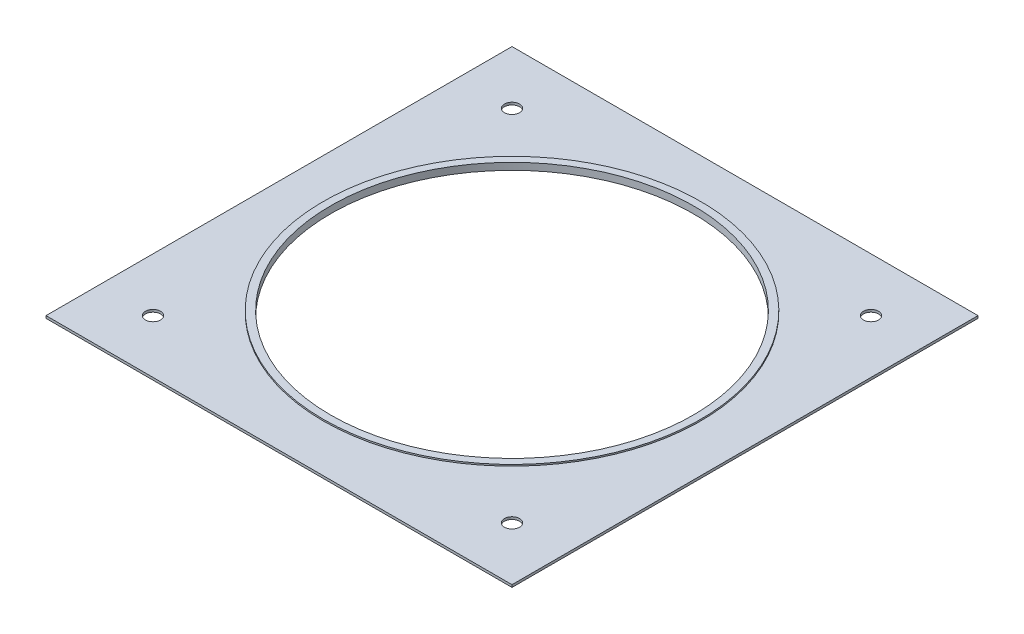
ISO-10303-21;
HEADER;
FILE_DESCRIPTION(('STEP AP214'),'2;1');
FILE_NAME('part.step','',(''),(''),'','','');
FILE_SCHEMA(('AUTOMOTIVE_DESIGN { 1 0 10303 214 1 1 1 1 }'));
ENDSEC;
DATA;
#1=APPLICATION_CONTEXT('core data for automotive mechanical design processes');
#2=APPLICATION_PROTOCOL_DEFINITION('international standard','automotive_design',2000,#1);
#3=PRODUCT_CONTEXT('',#1,'mechanical');
#4=PRODUCT('Part','Part','',(#3));
#5=PRODUCT_RELATED_PRODUCT_CATEGORY('part','',(#4));
#6=PRODUCT_DEFINITION_FORMATION('','',#4);
#7=PRODUCT_DEFINITION_CONTEXT('part definition',#1,'design');
#8=PRODUCT_DEFINITION('design','',#6,#7);
#9=PRODUCT_DEFINITION_SHAPE('','',#8);
#10=(LENGTH_UNIT() NAMED_UNIT(*) SI_UNIT(.MILLI.,.METRE.));
#11=(NAMED_UNIT(*) PLANE_ANGLE_UNIT() SI_UNIT($,.RADIAN.));
#12=(NAMED_UNIT(*) SI_UNIT($,.STERADIAN.) SOLID_ANGLE_UNIT());
#13=UNCERTAINTY_MEASURE_WITH_UNIT(LENGTH_MEASURE(1.E-05),#10,'distance_accuracy_value','');
#14=(GEOMETRIC_REPRESENTATION_CONTEXT(3) GLOBAL_UNCERTAINTY_ASSIGNED_CONTEXT((#13)) GLOBAL_UNIT_ASSIGNED_CONTEXT((#10,
#11,#12)) REPRESENTATION_CONTEXT('',''));
#15=CARTESIAN_POINT('',(0.,0.,0.));
#16=DIRECTION('',(0.,0.,1.));
#17=DIRECTION('',(1.,0.,0.));
#18=AXIS2_PLACEMENT_3D('',#15,#16,#17);
#19=CARTESIAN_POINT('',(0.,0.8,0.));
#20=DIRECTION('',(0.,-1.,0.));
#21=DIRECTION('',(0.,0.,-1.));
#22=AXIS2_PLACEMENT_3D('',#19,#20,#21);
#23=PLANE('',#22);
#24=CARTESIAN_POINT('',(-59.39696961967,0.8,59.39696961967));
#25=DIRECTION('',(0.,1.,0.));
#26=DIRECTION('',(0.,0.,-1.));
#27=AXIS2_PLACEMENT_3D('',#24,#25,#26);
#28=CIRCLE('',#27,2.5);
#29=CARTESIAN_POINT('',(-59.39696961967,0.8,56.89696961967));
#30=VERTEX_POINT('',#29);
#31=EDGE_CURVE('E186',#30,#30,#28,.T.);
#32=ORIENTED_EDGE('',*,*,#31,.F.);
#33=EDGE_LOOP('',(#32));
#34=FACE_BOUND('',#33,.T.);
#35=CARTESIAN_POINT('',(59.39696961967,0.8,59.39696961967));
#36=DIRECTION('',(0.,1.,0.));
#37=DIRECTION('',(0.,0.,1.));
#38=AXIS2_PLACEMENT_3D('',#35,#36,#37);
#39=CIRCLE('',#38,2.5);
#40=CARTESIAN_POINT('',(59.39696961967,0.8,61.89696961967));
#41=VERTEX_POINT('',#40);
#42=EDGE_CURVE('E183',#41,#41,#39,.T.);
#43=ORIENTED_EDGE('',*,*,#42,.F.);
#44=EDGE_LOOP('',(#43));
#45=FACE_BOUND('',#44,.T.);
#46=CARTESIAN_POINT('',(59.39696961967,0.8,-59.39696961967));
#47=DIRECTION('',(0.,1.,0.));
#48=DIRECTION('',(0.,0.,-1.));
#49=AXIS2_PLACEMENT_3D('',#46,#47,#48);
#50=CIRCLE('',#49,2.5);
#51=CARTESIAN_POINT('',(59.39696961967,0.8,-61.89696961967));
#52=VERTEX_POINT('',#51);
#53=EDGE_CURVE('E188',#52,#52,#50,.T.);
#54=ORIENTED_EDGE('',*,*,#53,.F.);
#55=EDGE_LOOP('',(#54));
#56=FACE_BOUND('',#55,.T.);
#57=CARTESIAN_POINT('',(-59.39696961967,0.8,-59.39696961967));
#58=DIRECTION('',(0.,1.,0.));
#59=DIRECTION('',(0.,0.,1.));
#60=AXIS2_PLACEMENT_3D('',#57,#58,#59);
#61=CIRCLE('',#60,2.5);
#62=CARTESIAN_POINT('',(-59.39696961967,0.8,-56.89696961967));
#63=VERTEX_POINT('',#62);
#64=EDGE_CURVE('E197',#63,#63,#61,.T.);
#65=ORIENTED_EDGE('',*,*,#64,.F.);
#66=EDGE_LOOP('',(#65));
#67=FACE_BOUND('',#66,.T.);
#68=DIRECTION('',(0.,0.,-1.));
#69=VECTOR('',#68,1.);
#70=CARTESIAN_POINT('',(77.1,0.8,77.1));
#71=LINE('',#70,#69);
#72=CARTESIAN_POINT('',(77.1,0.8,77.1));
#73=VERTEX_POINT('',#72);
#74=CARTESIAN_POINT('',(77.1,0.8,-77.1));
#75=VERTEX_POINT('',#74);
#76=EDGE_CURVE('E95',#73,#75,#71,.T.);
#77=ORIENTED_EDGE('',*,*,#76,.T.);
#78=DIRECTION('',(-1.,0.,0.));
#79=VECTOR('',#78,1.);
#80=CARTESIAN_POINT('',(-77.1,0.8,-77.1));
#81=LINE('',#80,#79);
#82=CARTESIAN_POINT('',(-77.1,0.8,-77.1));
#83=VERTEX_POINT('',#82);
#84=EDGE_CURVE('E90',#75,#83,#81,.T.);
#85=ORIENTED_EDGE('',*,*,#84,.T.);
#86=DIRECTION('',(0.,0.,1.));
#87=VECTOR('',#86,1.);
#88=CARTESIAN_POINT('',(-77.1,0.8,77.1));
#89=LINE('',#88,#87);
#90=CARTESIAN_POINT('',(-77.1,0.8,77.1));
#91=VERTEX_POINT('',#90);
#92=EDGE_CURVE('E93',#83,#91,#89,.T.);
#93=ORIENTED_EDGE('',*,*,#92,.T.);
#94=DIRECTION('',(1.,0.,0.));
#95=VECTOR('',#94,1.);
#96=CARTESIAN_POINT('',(-77.1,0.8,77.1));
#97=LINE('',#96,#95);
#98=EDGE_CURVE('E59',#91,#73,#97,.T.);
#99=ORIENTED_EDGE('',*,*,#98,.T.);
#100=EDGE_LOOP('',(#77,#85,#93,#99));
#101=FACE_BOUND('',#100,.T.);
#102=CARTESIAN_POINT('',(0.,0.8,0.));
#103=DIRECTION('',(0.,-1.,0.));
#104=DIRECTION('',(0.,0.,-1.));
#105=AXIS2_PLACEMENT_3D('',#102,#103,#104);
#106=CIRCLE('',#105,60.9958105872839);
#107=CARTESIAN_POINT('',(0.,0.8,-60.9958105872839));
#108=VERTEX_POINT('',#107);
#109=EDGE_CURVE('E11',#108,#108,#106,.F.);
#110=ORIENTED_EDGE('',*,*,#109,.F.);
#111=EDGE_LOOP('',(#110));
#112=FACE_BOUND('',#111,.T.);
#113=ADVANCED_FACE('F42',(#34,#45,#56,#67,#101,#112),#23,.F.);
#114=CARTESIAN_POINT('',(77.1,0.8,77.1));
#115=DIRECTION('',(-1.,0.,0.));
#116=DIRECTION('',(0.,0.,1.));
#117=AXIS2_PLACEMENT_3D('',#114,#115,#116);
#118=PLANE('',#117);
#119=DIRECTION('',(0.,0.,-1.));
#120=VECTOR('',#119,1.);
#121=CARTESIAN_POINT('',(77.1,0.,77.1));
#122=LINE('',#121,#120);
#123=CARTESIAN_POINT('',(77.1,0.,77.1));
#124=VERTEX_POINT('',#123);
#125=CARTESIAN_POINT('',(77.1,0.,-77.1));
#126=VERTEX_POINT('',#125);
#127=EDGE_CURVE('E109',#124,#126,#122,.T.);
#128=ORIENTED_EDGE('',*,*,#127,.T.);
#129=DIRECTION('',(0.,-1.,0.));
#130=VECTOR('',#129,1.);
#131=CARTESIAN_POINT('',(77.1,0.8,-77.1));
#132=LINE('',#131,#130);
#133=EDGE_CURVE('E51',#75,#126,#132,.T.);
#134=ORIENTED_EDGE('',*,*,#133,.F.);
#135=ORIENTED_EDGE('',*,*,#76,.F.);
#136=DIRECTION('',(0.,-1.,0.));
#137=VECTOR('',#136,1.);
#138=CARTESIAN_POINT('',(77.1,0.8,77.1));
#139=LINE('',#138,#137);
#140=EDGE_CURVE('E105',#73,#124,#139,.T.);
#141=ORIENTED_EDGE('',*,*,#140,.T.);
#142=EDGE_LOOP('',(#128,#134,#135,#141));
#143=FACE_BOUND('',#142,.T.);
#144=ADVANCED_FACE('F44',(#143),#118,.F.);
#145=CARTESIAN_POINT('',(-77.1,0.8,-77.1));
#146=DIRECTION('',(0.,0.,1.));
#147=DIRECTION('',(1.,0.,0.));
#148=AXIS2_PLACEMENT_3D('',#145,#146,#147);
#149=PLANE('',#148);
#150=DIRECTION('',(-1.,0.,0.));
#151=VECTOR('',#150,1.);
#152=CARTESIAN_POINT('',(-77.1,0.,-77.1));
#153=LINE('',#152,#151);
#154=CARTESIAN_POINT('',(-77.1,0.,-77.1));
#155=VERTEX_POINT('',#154);
#156=EDGE_CURVE('E100',#126,#155,#153,.T.);
#157=ORIENTED_EDGE('',*,*,#156,.T.);
#158=DIRECTION('',(0.,-1.,0.));
#159=VECTOR('',#158,1.);
#160=CARTESIAN_POINT('',(-77.1,0.8,-77.1));
#161=LINE('',#160,#159);
#162=EDGE_CURVE('E98',#83,#155,#161,.T.);
#163=ORIENTED_EDGE('',*,*,#162,.F.);
#164=ORIENTED_EDGE('',*,*,#84,.F.);
#165=ORIENTED_EDGE('',*,*,#133,.T.);
#166=EDGE_LOOP('',(#157,#163,#164,#165));
#167=FACE_BOUND('',#166,.T.);
#168=ADVANCED_FACE('F99',(#167),#149,.F.);
#169=CARTESIAN_POINT('',(-77.1,0.8,77.1));
#170=DIRECTION('',(1.,0.,0.));
#171=DIRECTION('',(0.,0.,-1.));
#172=AXIS2_PLACEMENT_3D('',#169,#170,#171);
#173=PLANE('',#172);
#174=DIRECTION('',(0.,0.,1.));
#175=VECTOR('',#174,1.);
#176=CARTESIAN_POINT('',(-77.1,0.,77.1));
#177=LINE('',#176,#175);
#178=CARTESIAN_POINT('',(-77.1,0.,77.1));
#179=VERTEX_POINT('',#178);
#180=EDGE_CURVE('E76',#155,#179,#177,.T.);
#181=ORIENTED_EDGE('',*,*,#180,.T.);
#182=DIRECTION('',(0.,-1.,0.));
#183=VECTOR('',#182,1.);
#184=CARTESIAN_POINT('',(-77.1,0.8,77.1));
#185=LINE('',#184,#183);
#186=EDGE_CURVE('E101',#91,#179,#185,.T.);
#187=ORIENTED_EDGE('',*,*,#186,.F.);
#188=ORIENTED_EDGE('',*,*,#92,.F.);
#189=ORIENTED_EDGE('',*,*,#162,.T.);
#190=EDGE_LOOP('',(#181,#187,#188,#189));
#191=FACE_BOUND('',#190,.T.);
#192=ADVANCED_FACE('F103',(#191),#173,.F.);
#193=CARTESIAN_POINT('',(-77.1,0.8,77.1));
#194=DIRECTION('',(0.,0.,-1.));
#195=DIRECTION('',(-1.,0.,0.));
#196=AXIS2_PLACEMENT_3D('',#193,#194,#195);
#197=PLANE('',#196);
#198=DIRECTION('',(1.,0.,0.));
#199=VECTOR('',#198,1.);
#200=CARTESIAN_POINT('',(-77.1,0.,77.1));
#201=LINE('',#200,#199);
#202=EDGE_CURVE('E82',#179,#124,#201,.T.);
#203=ORIENTED_EDGE('',*,*,#202,.T.);
#204=ORIENTED_EDGE('',*,*,#140,.F.);
#205=ORIENTED_EDGE('',*,*,#98,.F.);
#206=ORIENTED_EDGE('',*,*,#186,.T.);
#207=EDGE_LOOP('',(#203,#204,#205,#206));
#208=FACE_BOUND('',#207,.T.);
#209=ADVANCED_FACE('F123',(#208),#197,.F.);
#210=CARTESIAN_POINT('',(0.,0.,0.));
#211=DIRECTION('',(0.,-1.,0.));
#212=DIRECTION('',(0.,0.,-1.));
#213=AXIS2_PLACEMENT_3D('',#210,#211,#212);
#214=PLANE('',#213);
#215=CARTESIAN_POINT('',(-59.39696961967,0.,59.39696961967));
#216=DIRECTION('',(0.,1.,0.));
#217=DIRECTION('',(0.,0.,-1.));
#218=AXIS2_PLACEMENT_3D('',#215,#216,#217);
#219=CIRCLE('',#218,2.5);
#220=CARTESIAN_POINT('',(-59.39696961967,0.,56.89696961967));
#221=VERTEX_POINT('',#220);
#222=EDGE_CURVE('E184',#221,#221,#219,.T.);
#223=ORIENTED_EDGE('',*,*,#222,.T.);
#224=EDGE_LOOP('',(#223));
#225=FACE_BOUND('',#224,.T.);
#226=CARTESIAN_POINT('',(59.39696961967,0.,59.39696961967));
#227=DIRECTION('',(0.,1.,0.));
#228=DIRECTION('',(0.,0.,1.));
#229=AXIS2_PLACEMENT_3D('',#226,#227,#228);
#230=CIRCLE('',#229,2.5);
#231=CARTESIAN_POINT('',(59.39696961967,0.,61.89696961967));
#232=VERTEX_POINT('',#231);
#233=EDGE_CURVE('E180',#232,#232,#230,.T.);
#234=ORIENTED_EDGE('',*,*,#233,.T.);
#235=EDGE_LOOP('',(#234));
#236=FACE_BOUND('',#235,.T.);
#237=CARTESIAN_POINT('',(59.39696961967,0.,-59.39696961967));
#238=DIRECTION('',(0.,1.,0.));
#239=DIRECTION('',(0.,0.,-1.));
#240=AXIS2_PLACEMENT_3D('',#237,#238,#239);
#241=CIRCLE('',#240,2.5);
#242=CARTESIAN_POINT('',(59.39696961967,0.,-61.89696961967));
#243=VERTEX_POINT('',#242);
#244=EDGE_CURVE('E193',#243,#243,#241,.T.);
#245=ORIENTED_EDGE('',*,*,#244,.T.);
#246=EDGE_LOOP('',(#245));
#247=FACE_BOUND('',#246,.T.);
#248=CARTESIAN_POINT('',(-59.39696961967,0.,-59.39696961967));
#249=DIRECTION('',(0.,1.,0.));
#250=DIRECTION('',(0.,0.,1.));
#251=AXIS2_PLACEMENT_3D('',#248,#249,#250);
#252=CIRCLE('',#251,2.5);
#253=CARTESIAN_POINT('',(-59.39696961967,0.,-56.89696961967));
#254=VERTEX_POINT('',#253);
#255=EDGE_CURVE('E199',#254,#254,#252,.T.);
#256=ORIENTED_EDGE('',*,*,#255,.T.);
#257=EDGE_LOOP('',(#256));
#258=FACE_BOUND('',#257,.T.);
#259=CARTESIAN_POINT('',(0.,0.,0.));
#260=DIRECTION('',(0.,1.,0.));
#261=DIRECTION('',(0.,0.,1.));
#262=AXIS2_PLACEMENT_3D('',#259,#260,#261);
#263=CIRCLE('',#262,60.);
#264=CARTESIAN_POINT('',(0.,0.,60.));
#265=VERTEX_POINT('',#264);
#266=EDGE_CURVE('E112',#265,#265,#263,.T.);
#267=ORIENTED_EDGE('',*,*,#266,.T.);
#268=EDGE_LOOP('',(#267));
#269=FACE_BOUND('',#268,.T.);
#270=ORIENTED_EDGE('',*,*,#127,.F.);
#271=ORIENTED_EDGE('',*,*,#202,.F.);
#272=ORIENTED_EDGE('',*,*,#180,.F.);
#273=ORIENTED_EDGE('',*,*,#156,.F.);
#274=EDGE_LOOP('',(#270,#271,#272,#273));
#275=FACE_BOUND('',#274,.T.);
#276=ADVANCED_FACE('F120',(#225,#236,#247,#258,#269,#275),#214,.T.);
#277=CARTESIAN_POINT('',(0.,0.,0.));
#278=DIRECTION('',(0.,1.,0.));
#279=DIRECTION('',(0.,0.,1.));
#280=AXIS2_PLACEMENT_3D('',#277,#278,#279);
#281=CYLINDRICAL_SURFACE('',#280,60.);
#282=CARTESIAN_POINT('',(0.,2.3,0.));
#283=DIRECTION('',(0.,1.,0.));
#284=DIRECTION('',(0.,0.,1.));
#285=AXIS2_PLACEMENT_3D('',#282,#283,#284);
#286=CIRCLE('',#285,60.);
#287=CARTESIAN_POINT('',(0.,2.3,60.));
#288=VERTEX_POINT('',#287);
#289=EDGE_CURVE('E202',#288,#288,#286,.T.);
#290=ORIENTED_EDGE('',*,*,#289,.T.);
#291=EDGE_LOOP('',(#290));
#292=FACE_BOUND('',#291,.T.);
#293=ORIENTED_EDGE('',*,*,#266,.F.);
#294=EDGE_LOOP('',(#293));
#295=FACE_BOUND('',#294,.T.);
#296=ADVANCED_FACE('F122',(#292,#295),#281,.F.);
#297=CARTESIAN_POINT('',(0.,1.8,0.));
#298=DIRECTION('',(0.,-1.,0.));
#299=DIRECTION('',(0.,0.,-1.));
#300=AXIS2_PLACEMENT_3D('',#297,#298,#299);
#301=CYLINDRICAL_SURFACE('',#300,60.9958105872839);
#302=CARTESIAN_POINT('',(0.,1.8,0.));
#303=DIRECTION('',(0.,1.,0.));
#304=DIRECTION('',(0.,0.,1.));
#305=AXIS2_PLACEMENT_3D('',#302,#303,#304);
#306=CIRCLE('',#305,60.9958105872839);
#307=CARTESIAN_POINT('',(0.,1.8,60.9958105872839));
#308=VERTEX_POINT('',#307);
#309=EDGE_CURVE('E211',#308,#308,#306,.T.);
#310=ORIENTED_EDGE('',*,*,#309,.F.);
#311=EDGE_LOOP('',(#310));
#312=FACE_BOUND('',#311,.T.);
#313=ORIENTED_EDGE('',*,*,#109,.T.);
#314=EDGE_LOOP('',(#313));
#315=FACE_BOUND('',#314,.T.);
#316=ADVANCED_FACE('F130',(#312,#315),#301,.T.);
#317=CARTESIAN_POINT('',(0.,2.3,0.));
#318=DIRECTION('',(0.,1.,0.));
#319=DIRECTION('',(0.,0.,1.));
#320=AXIS2_PLACEMENT_3D('',#317,#318,#319);
#321=PLANE('',#320);
#322=CARTESIAN_POINT('',(0.,2.3,0.));
#323=DIRECTION('',(0.,1.,0.));
#324=DIRECTION('',(0.,0.,1.));
#325=AXIS2_PLACEMENT_3D('',#322,#323,#324);
#326=CIRCLE('',#325,62.4340192611235);
#327=CARTESIAN_POINT('',(0.,2.3,62.4340192611235));
#328=VERTEX_POINT('',#327);
#329=EDGE_CURVE('E208',#328,#328,#326,.T.);
#330=ORIENTED_EDGE('',*,*,#329,.T.);
#331=EDGE_LOOP('',(#330));
#332=FACE_BOUND('',#331,.T.);
#333=ORIENTED_EDGE('',*,*,#289,.F.);
#334=EDGE_LOOP('',(#333));
#335=FACE_BOUND('',#334,.T.);
#336=ADVANCED_FACE('F147',(#332,#335),#321,.T.);
#337=CARTESIAN_POINT('',(0.,1.8,0.));
#338=DIRECTION('',(0.,1.,0.));
#339=DIRECTION('',(0.,0.,1.));
#340=AXIS2_PLACEMENT_3D('',#337,#338,#339);
#341=PLANE('',#340);
#342=ORIENTED_EDGE('',*,*,#309,.T.);
#343=EDGE_LOOP('',(#342));
#344=FACE_BOUND('',#343,.T.);
#345=CARTESIAN_POINT('',(0.,1.8,0.));
#346=DIRECTION('',(0.,1.,0.));
#347=DIRECTION('',(0.,0.,1.));
#348=AXIS2_PLACEMENT_3D('',#345,#346,#347);
#349=CIRCLE('',#348,62.4340192611235);
#350=CARTESIAN_POINT('',(0.,1.8,62.4340192611235));
#351=VERTEX_POINT('',#350);
#352=EDGE_CURVE('E207',#351,#351,#349,.T.);
#353=ORIENTED_EDGE('',*,*,#352,.F.);
#354=EDGE_LOOP('',(#353));
#355=FACE_BOUND('',#354,.T.);
#356=ADVANCED_FACE('F153',(#344,#355),#341,.F.);
#357=CARTESIAN_POINT('',(0.,2.3,0.));
#358=DIRECTION('',(0.,-1.,0.));
#359=DIRECTION('',(0.,0.,-1.));
#360=AXIS2_PLACEMENT_3D('',#357,#358,#359);
#361=CYLINDRICAL_SURFACE('',#360,62.4340192611235);
#362=ORIENTED_EDGE('',*,*,#329,.F.);
#363=EDGE_LOOP('',(#362));
#364=FACE_BOUND('',#363,.T.);
#365=ORIENTED_EDGE('',*,*,#352,.T.);
#366=EDGE_LOOP('',(#365));
#367=FACE_BOUND('',#366,.T.);
#368=ADVANCED_FACE('F149',(#364,#367),#361,.T.);
#369=CARTESIAN_POINT('',(-59.39696961967,0.,-59.39696961967));
#370=DIRECTION('',(0.,1.,0.));
#371=DIRECTION('',(0.,0.,1.));
#372=AXIS2_PLACEMENT_3D('',#369,#370,#371);
#373=CYLINDRICAL_SURFACE('',#372,2.5);
#374=ORIENTED_EDGE('',*,*,#255,.F.);
#375=EDGE_LOOP('',(#374));
#376=FACE_BOUND('',#375,.T.);
#377=ORIENTED_EDGE('',*,*,#64,.T.);
#378=EDGE_LOOP('',(#377));
#379=FACE_BOUND('',#378,.T.);
#380=ADVANCED_FACE('F152',(#376,#379),#373,.F.);
#381=CARTESIAN_POINT('',(59.39696961967,0.,-59.39696961967));
#382=DIRECTION('',(0.,1.,0.));
#383=DIRECTION('',(0.,0.,1.));
#384=AXIS2_PLACEMENT_3D('',#381,#382,#383);
#385=CYLINDRICAL_SURFACE('',#384,2.5);
#386=ORIENTED_EDGE('',*,*,#244,.F.);
#387=EDGE_LOOP('',(#386));
#388=FACE_BOUND('',#387,.T.);
#389=ORIENTED_EDGE('',*,*,#53,.T.);
#390=EDGE_LOOP('',(#389));
#391=FACE_BOUND('',#390,.T.);
#392=ADVANCED_FACE('F163',(#388,#391),#385,.F.);
#393=CARTESIAN_POINT('',(59.39696961967,0.,59.39696961967));
#394=DIRECTION('',(0.,1.,0.));
#395=DIRECTION('',(0.,0.,1.));
#396=AXIS2_PLACEMENT_3D('',#393,#394,#395);
#397=CYLINDRICAL_SURFACE('',#396,2.5);
#398=ORIENTED_EDGE('',*,*,#233,.F.);
#399=EDGE_LOOP('',(#398));
#400=FACE_BOUND('',#399,.T.);
#401=ORIENTED_EDGE('',*,*,#42,.T.);
#402=EDGE_LOOP('',(#401));
#403=FACE_BOUND('',#402,.T.);
#404=ADVANCED_FACE('F168',(#400,#403),#397,.F.);
#405=CARTESIAN_POINT('',(-59.39696961967,0.,59.39696961967));
#406=DIRECTION('',(0.,1.,0.));
#407=DIRECTION('',(0.,0.,1.));
#408=AXIS2_PLACEMENT_3D('',#405,#406,#407);
#409=CYLINDRICAL_SURFACE('',#408,2.5);
#410=ORIENTED_EDGE('',*,*,#222,.F.);
#411=EDGE_LOOP('',(#410));
#412=FACE_BOUND('',#411,.T.);
#413=ORIENTED_EDGE('',*,*,#31,.T.);
#414=EDGE_LOOP('',(#413));
#415=FACE_BOUND('',#414,.T.);
#416=ADVANCED_FACE('F165',(#412,#415),#409,.F.);
#417=CLOSED_SHELL('',(#113,#144,#168,#192,#209,#276,#296,#316,#336,#356,#368,#380,#392,#404,#416));
#418=MANIFOLD_SOLID_BREP('B2',#417);
#419=ADVANCED_BREP_SHAPE_REPRESENTATION('',(#18,#418),#14);
#420=SHAPE_DEFINITION_REPRESENTATION(#9,#419);
ENDSEC;
END-ISO-10303-21;
